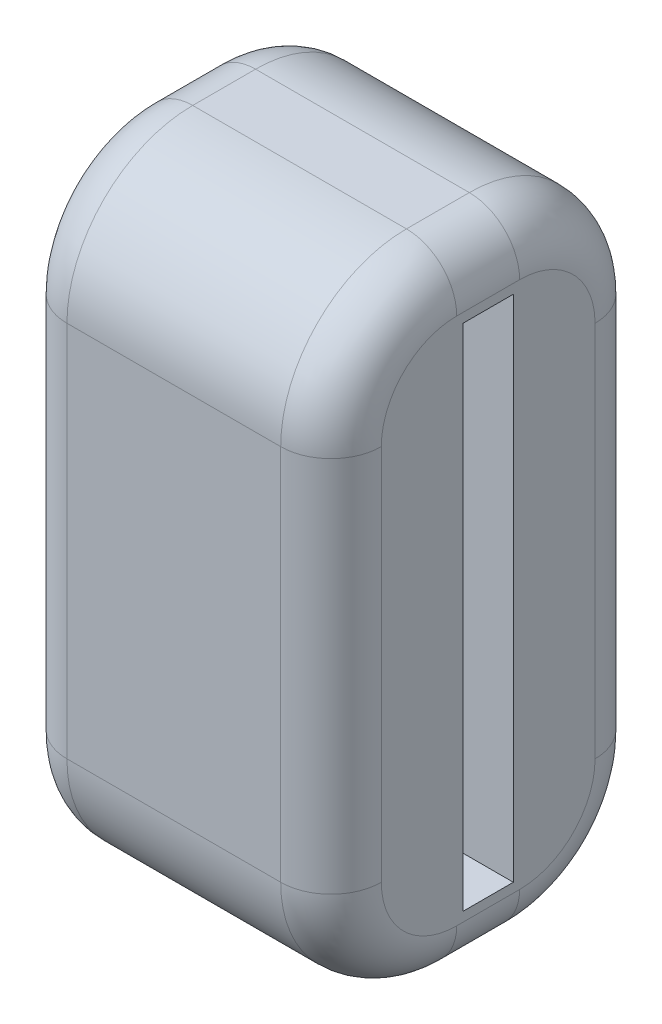
ISO-10303-21;
HEADER;
FILE_DESCRIPTION(('STEP AP214'),'2;1');
FILE_NAME('part.step','',(''),(''),'','','');
FILE_SCHEMA(('AUTOMOTIVE_DESIGN { 1 0 10303 214 1 1 1 1 }'));
ENDSEC;
DATA;
#1=APPLICATION_CONTEXT('core data for automotive mechanical design processes');
#2=APPLICATION_PROTOCOL_DEFINITION('international standard','automotive_design',2000,#1);
#3=PRODUCT_CONTEXT('',#1,'mechanical');
#4=PRODUCT('Part','Part','',(#3));
#5=PRODUCT_RELATED_PRODUCT_CATEGORY('part','',(#4));
#6=PRODUCT_DEFINITION_FORMATION('','',#4);
#7=PRODUCT_DEFINITION_CONTEXT('part definition',#1,'design');
#8=PRODUCT_DEFINITION('design','',#6,#7);
#9=PRODUCT_DEFINITION_SHAPE('','',#8);
#10=(LENGTH_UNIT() NAMED_UNIT(*) SI_UNIT(.MILLI.,.METRE.));
#11=(NAMED_UNIT(*) PLANE_ANGLE_UNIT() SI_UNIT($,.RADIAN.));
#12=(NAMED_UNIT(*) SI_UNIT($,.STERADIAN.) SOLID_ANGLE_UNIT());
#13=UNCERTAINTY_MEASURE_WITH_UNIT(LENGTH_MEASURE(1.E-05),#10,'distance_accuracy_value','');
#14=(GEOMETRIC_REPRESENTATION_CONTEXT(3) GLOBAL_UNCERTAINTY_ASSIGNED_CONTEXT((#13)) GLOBAL_UNIT_ASSIGNED_CONTEXT((#10,
#11,#12)) REPRESENTATION_CONTEXT('',''));
#15=CARTESIAN_POINT('',(0.,0.,0.));
#16=DIRECTION('',(0.,0.,1.));
#17=DIRECTION('',(1.,0.,0.));
#18=AXIS2_PLACEMENT_3D('',#15,#16,#17);
#19=CARTESIAN_POINT('',(4.2,11.7695349745345,28.9837322070634));
#20=DIRECTION('',(0.,0.,1.));
#21=DIRECTION('',(1.,0.,0.));
#22=AXIS2_PLACEMENT_3D('',#19,#20,#21);
#23=CYLINDRICAL_SURFACE('',#22,0.799999999999999);
#24=CARTESIAN_POINT('',(4.2,11.7695349745345,28.9837322070634));
#25=DIRECTION('',(0.,0.,-1.));
#26=DIRECTION('',(0.,1.,0.));
#27=AXIS2_PLACEMENT_3D('',#24,#25,#26);
#28=CIRCLE('',#27,0.799999999999998);
#29=CARTESIAN_POINT('',(5.,11.7695349745345,28.9837322070634));
#30=VERTEX_POINT('',#29);
#31=CARTESIAN_POINT('',(4.2,10.9695349745345,28.9837322070634));
#32=VERTEX_POINT('',#31);
#33=EDGE_CURVE('E74',#30,#32,#28,.T.);
#34=ORIENTED_EDGE('',*,*,#33,.F.);
#35=DIRECTION('',(0.,0.,-1.));
#36=VECTOR('',#35,1.);
#37=CARTESIAN_POINT('',(5.,11.7695349745345,29.4837322070634));
#38=LINE('',#37,#36);
#39=CARTESIAN_POINT('',(5.,11.7695349745345,29.9837322070634));
#40=VERTEX_POINT('',#39);
#41=EDGE_CURVE('E106',#40,#30,#38,.T.);
#42=ORIENTED_EDGE('',*,*,#41,.F.);
#43=CARTESIAN_POINT('',(4.2,11.7695349745345,29.9837322070634));
#44=DIRECTION('',(0.,0.,1.));
#45=DIRECTION('',(1.,0.,0.));
#46=AXIS2_PLACEMENT_3D('',#43,#44,#45);
#47=CIRCLE('',#46,0.799999999999998);
#48=CARTESIAN_POINT('',(4.2,10.9695349745345,29.9837322070634));
#49=VERTEX_POINT('',#48);
#50=EDGE_CURVE('E237',#49,#40,#47,.T.);
#51=ORIENTED_EDGE('',*,*,#50,.F.);
#52=DIRECTION('',(0.,0.,1.));
#53=VECTOR('',#52,1.);
#54=CARTESIAN_POINT('',(4.2,10.9695349745345,29.4837322070634));
#55=LINE('',#54,#53);
#56=EDGE_CURVE('E231',#32,#49,#55,.T.);
#57=ORIENTED_EDGE('',*,*,#56,.F.);
#58=EDGE_LOOP('',(#34,#42,#51,#57));
#59=FACE_BOUND('',#58,.T.);
#60=ADVANCED_FACE('F17',(#59),#23,.T.);
#61=CARTESIAN_POINT('',(4.2,12.9695349745345,28.9837322070634));
#62=DIRECTION('',(1.,0.,0.));
#63=DIRECTION('',(0.,0.,-1.));
#64=AXIS2_PLACEMENT_3D('',#61,#62,#63);
#65=TOROIDAL_SURFACE('',#64,1.2,0.799999999999998);
#66=ORIENTED_EDGE('',*,*,#33,.T.);
#67=CARTESIAN_POINT('',(4.2,12.9695349745345,28.9837322070634));
#68=DIRECTION('',(-1.,0.,0.));
#69=DIRECTION('',(0.,0.,1.));
#70=AXIS2_PLACEMENT_3D('',#67,#68,#69);
#71=CIRCLE('',#70,2.);
#72=CARTESIAN_POINT('',(4.2,12.9695349745345,26.9837322070634));
#73=VERTEX_POINT('',#72);
#74=EDGE_CURVE('E87',#73,#32,#71,.T.);
#75=ORIENTED_EDGE('',*,*,#74,.F.);
#76=CARTESIAN_POINT('',(4.2,12.9695349745345,27.7837322070634));
#77=DIRECTION('',(0.,1.,0.));
#78=DIRECTION('',(0.,0.,1.));
#79=AXIS2_PLACEMENT_3D('',#76,#77,#78);
#80=CIRCLE('',#79,0.800000000000001);
#81=CARTESIAN_POINT('',(5.,12.9695349745345,27.7837322070634));
#82=VERTEX_POINT('',#81);
#83=EDGE_CURVE('E80',#82,#73,#80,.T.);
#84=ORIENTED_EDGE('',*,*,#83,.F.);
#85=CARTESIAN_POINT('',(5.,12.9695349745345,28.9837322070634));
#86=DIRECTION('',(1.,0.,0.));
#87=DIRECTION('',(0.,0.,-1.));
#88=AXIS2_PLACEMENT_3D('',#85,#86,#87);
#89=CIRCLE('',#88,1.2);
#90=EDGE_CURVE('E21',#30,#82,#89,.T.);
#91=ORIENTED_EDGE('',*,*,#90,.F.);
#92=EDGE_LOOP('',(#66,#75,#84,#91));
#93=FACE_BOUND('',#92,.T.);
#94=ADVANCED_FACE('F82',(#93),#65,.T.);
#95=CARTESIAN_POINT('',(4.2,18.9695349745345,27.7837322070634));
#96=DIRECTION('',(0.,-1.,0.));
#97=DIRECTION('',(0.,0.,-1.));
#98=AXIS2_PLACEMENT_3D('',#95,#96,#97);
#99=CYLINDRICAL_SURFACE('',#98,0.800000000000001);
#100=ORIENTED_EDGE('',*,*,#83,.T.);
#101=DIRECTION('',(0.,-1.,0.));
#102=VECTOR('',#101,1.);
#103=CARTESIAN_POINT('',(4.2,15.9695349745345,26.9837322070634));
#104=LINE('',#103,#102);
#105=CARTESIAN_POINT('',(4.2,18.9695349745345,26.9837322070634));
#106=VERTEX_POINT('',#105);
#107=EDGE_CURVE('E152',#106,#73,#104,.T.);
#108=ORIENTED_EDGE('',*,*,#107,.F.);
#109=CARTESIAN_POINT('',(4.2,18.9695349745345,27.7837322070634));
#110=DIRECTION('',(0.,1.,0.));
#111=DIRECTION('',(0.,0.,1.));
#112=AXIS2_PLACEMENT_3D('',#109,#110,#111);
#113=CIRCLE('',#112,0.799999999999999);
#114=CARTESIAN_POINT('',(5.,18.9695349745345,27.7837322070634));
#115=VERTEX_POINT('',#114);
#116=EDGE_CURVE('E92',#115,#106,#113,.T.);
#117=ORIENTED_EDGE('',*,*,#116,.F.);
#118=DIRECTION('',(0.,1.,0.));
#119=VECTOR('',#118,1.);
#120=CARTESIAN_POINT('',(5.,15.9695349745345,27.7837322070634));
#121=LINE('',#120,#119);
#122=EDGE_CURVE('E95',#82,#115,#121,.T.);
#123=ORIENTED_EDGE('',*,*,#122,.F.);
#124=EDGE_LOOP('',(#100,#108,#117,#123));
#125=FACE_BOUND('',#124,.T.);
#126=ADVANCED_FACE('F96',(#125),#99,.T.);
#127=CARTESIAN_POINT('',(4.2,18.9695349745345,28.9837322070634));
#128=DIRECTION('',(1.,0.,0.));
#129=DIRECTION('',(0.,0.,-1.));
#130=AXIS2_PLACEMENT_3D('',#127,#128,#129);
#131=TOROIDAL_SURFACE('',#130,1.2,0.799999999999999);
#132=ORIENTED_EDGE('',*,*,#116,.T.);
#133=CARTESIAN_POINT('',(4.2,18.9695349745345,28.9837322070634));
#134=DIRECTION('',(-1.,0.,0.));
#135=DIRECTION('',(0.,0.,1.));
#136=AXIS2_PLACEMENT_3D('',#133,#134,#135);
#137=CIRCLE('',#136,2.);
#138=CARTESIAN_POINT('',(4.2,20.9695349745345,28.9837322070634));
#139=VERTEX_POINT('',#138);
#140=EDGE_CURVE('E164',#139,#106,#137,.T.);
#141=ORIENTED_EDGE('',*,*,#140,.F.);
#142=CARTESIAN_POINT('',(4.2,20.1695349745345,28.9837322070634));
#143=DIRECTION('',(0.,0.,1.));
#144=DIRECTION('',(1.,0.,0.));
#145=AXIS2_PLACEMENT_3D('',#142,#143,#144);
#146=CIRCLE('',#145,0.799999999999997);
#147=CARTESIAN_POINT('',(5.,20.1695349745345,28.9837322070634));
#148=VERTEX_POINT('',#147);
#149=EDGE_CURVE('E232',#148,#139,#146,.T.);
#150=ORIENTED_EDGE('',*,*,#149,.F.);
#151=CARTESIAN_POINT('',(5.,18.9695349745345,28.9837322070634));
#152=DIRECTION('',(1.,0.,0.));
#153=DIRECTION('',(0.,0.,-1.));
#154=AXIS2_PLACEMENT_3D('',#151,#152,#153);
#155=CIRCLE('',#154,1.20000000000001);
#156=EDGE_CURVE('E101',#115,#148,#155,.T.);
#157=ORIENTED_EDGE('',*,*,#156,.F.);
#158=EDGE_LOOP('',(#132,#141,#150,#157));
#159=FACE_BOUND('',#158,.T.);
#160=ADVANCED_FACE('F505',(#159),#131,.T.);
#161=CARTESIAN_POINT('',(4.2,20.1695349745345,29.9837322070634));
#162=DIRECTION('',(0.,0.,-1.));
#163=DIRECTION('',(-1.,0.,0.));
#164=AXIS2_PLACEMENT_3D('',#161,#162,#163);
#165=CYLINDRICAL_SURFACE('',#164,0.799999999999997);
#166=ORIENTED_EDGE('',*,*,#149,.T.);
#167=DIRECTION('',(0.,0.,-1.));
#168=VECTOR('',#167,1.);
#169=CARTESIAN_POINT('',(4.2,20.9695349745345,29.4837322070634));
#170=LINE('',#169,#168);
#171=CARTESIAN_POINT('',(4.2,20.9695349745345,29.9837322070634));
#172=VERTEX_POINT('',#171);
#173=EDGE_CURVE('E176',#172,#139,#170,.T.);
#174=ORIENTED_EDGE('',*,*,#173,.F.);
#175=CARTESIAN_POINT('',(4.2,20.1695349745345,29.9837322070634));
#176=DIRECTION('',(0.,0.,1.));
#177=DIRECTION('',(1.,0.,0.));
#178=AXIS2_PLACEMENT_3D('',#175,#176,#177);
#179=CIRCLE('',#178,0.799999999999997);
#180=CARTESIAN_POINT('',(5.,20.1695349745345,29.9837322070634));
#181=VERTEX_POINT('',#180);
#182=EDGE_CURVE('E200',#181,#172,#179,.T.);
#183=ORIENTED_EDGE('',*,*,#182,.F.);
#184=DIRECTION('',(0.,0.,1.));
#185=VECTOR('',#184,1.);
#186=CARTESIAN_POINT('',(5.,20.1695349745345,29.4837322070634));
#187=LINE('',#186,#185);
#188=EDGE_CURVE('E293',#148,#181,#187,.T.);
#189=ORIENTED_EDGE('',*,*,#188,.F.);
#190=EDGE_LOOP('',(#166,#174,#183,#189));
#191=FACE_BOUND('',#190,.T.);
#192=ADVANCED_FACE('F497',(#191),#165,.T.);
#193=CARTESIAN_POINT('',(0.79,10.9695349745345,29.9937322070634));
#194=DIRECTION('',(0.,-1.,0.));
#195=DIRECTION('',(0.,0.,-1.));
#196=AXIS2_PLACEMENT_3D('',#193,#194,#195);
#197=PLANE('',#196);
#198=ORIENTED_EDGE('',*,*,#56,.T.);
#199=DIRECTION('',(1.,0.,0.));
#200=VECTOR('',#199,1.);
#201=CARTESIAN_POINT('',(2.5,10.9695349745345,29.9837322070634));
#202=LINE('',#201,#200);
#203=CARTESIAN_POINT('',(0.8,10.9695349745345,29.9837322070634));
#204=VERTEX_POINT('',#203);
#205=EDGE_CURVE('E132',#204,#49,#202,.T.);
#206=ORIENTED_EDGE('',*,*,#205,.F.);
#207=DIRECTION('',(0.,0.,-1.));
#208=VECTOR('',#207,1.);
#209=CARTESIAN_POINT('',(0.8,10.9695349745345,29.4837322070634));
#210=LINE('',#209,#208);
#211=CARTESIAN_POINT('',(0.8,10.9695349745345,28.9837322070634));
#212=VERTEX_POINT('',#211);
#213=EDGE_CURVE('E228',#204,#212,#210,.T.);
#214=ORIENTED_EDGE('',*,*,#213,.T.);
#215=DIRECTION('',(-1.,0.,0.));
#216=VECTOR('',#215,1.);
#217=CARTESIAN_POINT('',(2.5,10.9695349745345,28.9837322070634));
#218=LINE('',#217,#216);
#219=EDGE_CURVE('E110',#32,#212,#218,.T.);
#220=ORIENTED_EDGE('',*,*,#219,.F.);
#221=EDGE_LOOP('',(#198,#206,#214,#220));
#222=FACE_BOUND('',#221,.T.);
#223=ADVANCED_FACE('F495',(#222),#197,.T.);
#224=CARTESIAN_POINT('',(4.2,12.9695349745345,29.9837322070634));
#225=DIRECTION('',(1.,0.,0.));
#226=DIRECTION('',(0.,0.,-1.));
#227=AXIS2_PLACEMENT_3D('',#224,#225,#226);
#228=TOROIDAL_SURFACE('',#227,1.2,0.799999999999996);
#229=CARTESIAN_POINT('',(4.2,12.9695349745345,31.1837322070634));
#230=DIRECTION('',(0.,-1.,0.));
#231=DIRECTION('',(0.,0.,-1.));
#232=AXIS2_PLACEMENT_3D('',#229,#230,#231);
#233=CIRCLE('',#232,0.799999999999996);
#234=CARTESIAN_POINT('',(5.,12.9695349745345,31.1837322070634));
#235=VERTEX_POINT('',#234);
#236=CARTESIAN_POINT('',(4.2,12.9695349745345,31.9837322070634));
#237=VERTEX_POINT('',#236);
#238=EDGE_CURVE('E214',#235,#237,#233,.T.);
#239=ORIENTED_EDGE('',*,*,#238,.T.);
#240=CARTESIAN_POINT('',(4.2,12.9695349745345,29.9837322070634));
#241=DIRECTION('',(-1.,0.,0.));
#242=DIRECTION('',(0.,0.,1.));
#243=AXIS2_PLACEMENT_3D('',#240,#241,#242);
#244=CIRCLE('',#243,2.);
#245=EDGE_CURVE('E135',#49,#237,#244,.T.);
#246=ORIENTED_EDGE('',*,*,#245,.F.);
#247=ORIENTED_EDGE('',*,*,#50,.T.);
#248=CARTESIAN_POINT('',(5.,12.9695349745345,29.9837322070634));
#249=DIRECTION('',(1.,0.,0.));
#250=DIRECTION('',(0.,0.,-1.));
#251=AXIS2_PLACEMENT_3D('',#248,#249,#250);
#252=CIRCLE('',#251,1.2);
#253=EDGE_CURVE('E289',#235,#40,#252,.T.);
#254=ORIENTED_EDGE('',*,*,#253,.F.);
#255=EDGE_LOOP('',(#239,#246,#247,#254));
#256=FACE_BOUND('',#255,.T.);
#257=ADVANCED_FACE('F493',(#256),#228,.T.);
#258=CARTESIAN_POINT('',(4.2,18.9695349745345,29.9837322070634));
#259=DIRECTION('',(1.,0.,0.));
#260=DIRECTION('',(0.,0.,-1.));
#261=AXIS2_PLACEMENT_3D('',#258,#259,#260);
#262=TOROIDAL_SURFACE('',#261,1.20000000000001,0.799999999999997);
#263=ORIENTED_EDGE('',*,*,#182,.T.);
#264=CARTESIAN_POINT('',(4.2,18.9695349745345,29.9837322070634));
#265=DIRECTION('',(-1.,0.,0.));
#266=DIRECTION('',(0.,0.,1.));
#267=AXIS2_PLACEMENT_3D('',#264,#265,#266);
#268=CIRCLE('',#267,2.);
#269=CARTESIAN_POINT('',(4.2,18.9695349745345,31.9837322070634));
#270=VERTEX_POINT('',#269);
#271=EDGE_CURVE('E188',#270,#172,#268,.T.);
#272=ORIENTED_EDGE('',*,*,#271,.F.);
#273=CARTESIAN_POINT('',(4.2,18.9695349745345,31.1837322070634));
#274=DIRECTION('',(0.,-1.,0.));
#275=DIRECTION('',(0.,0.,-1.));
#276=AXIS2_PLACEMENT_3D('',#273,#274,#275);
#277=CIRCLE('',#276,0.799999999999997);
#278=CARTESIAN_POINT('',(5.,18.9695349745345,31.1837322070634));
#279=VERTEX_POINT('',#278);
#280=EDGE_CURVE('E209',#279,#270,#277,.T.);
#281=ORIENTED_EDGE('',*,*,#280,.F.);
#282=CARTESIAN_POINT('',(5.,18.9695349745345,29.9837322070634));
#283=DIRECTION('',(1.,0.,0.));
#284=DIRECTION('',(0.,0.,-1.));
#285=AXIS2_PLACEMENT_3D('',#282,#283,#284);
#286=CIRCLE('',#285,1.2);
#287=EDGE_CURVE('E292',#181,#279,#286,.T.);
#288=ORIENTED_EDGE('',*,*,#287,.F.);
#289=EDGE_LOOP('',(#263,#272,#281,#288));
#290=FACE_BOUND('',#289,.T.);
#291=ADVANCED_FACE('F466',(#290),#262,.T.);
#292=CARTESIAN_POINT('',(0.79,20.9695349745345,28.9737322070634));
#293=DIRECTION('',(0.,1.,0.));
#294=DIRECTION('',(0.,0.,1.));
#295=AXIS2_PLACEMENT_3D('',#292,#293,#294);
#296=PLANE('',#295);
#297=ORIENTED_EDGE('',*,*,#173,.T.);
#298=DIRECTION('',(1.,0.,0.));
#299=VECTOR('',#298,1.);
#300=CARTESIAN_POINT('',(2.5,20.9695349745345,28.9837322070634));
#301=LINE('',#300,#299);
#302=CARTESIAN_POINT('',(0.8,20.9695349745345,28.9837322070634));
#303=VERTEX_POINT('',#302);
#304=EDGE_CURVE('E173',#303,#139,#301,.T.);
#305=ORIENTED_EDGE('',*,*,#304,.F.);
#306=DIRECTION('',(0.,0.,1.));
#307=VECTOR('',#306,1.);
#308=CARTESIAN_POINT('',(0.8,20.9695349745345,29.4837322070634));
#309=LINE('',#308,#307);
#310=CARTESIAN_POINT('',(0.8,20.9695349745345,29.9837322070634));
#311=VERTEX_POINT('',#310);
#312=EDGE_CURVE('E197',#303,#311,#309,.T.);
#313=ORIENTED_EDGE('',*,*,#312,.T.);
#314=DIRECTION('',(-1.,0.,0.));
#315=VECTOR('',#314,1.);
#316=CARTESIAN_POINT('',(2.5,20.9695349745345,29.9837322070634));
#317=LINE('',#316,#315);
#318=EDGE_CURVE('E185',#172,#311,#317,.T.);
#319=ORIENTED_EDGE('',*,*,#318,.F.);
#320=EDGE_LOOP('',(#297,#305,#313,#319));
#321=FACE_BOUND('',#320,.T.);
#322=ADVANCED_FACE('F469',(#321),#296,.T.);
#323=CARTESIAN_POINT('',(4.2,18.9695349745345,28.9837322070634));
#324=DIRECTION('',(-1.,0.,0.));
#325=DIRECTION('',(0.,0.,1.));
#326=AXIS2_PLACEMENT_3D('',#323,#324,#325);
#327=CYLINDRICAL_SURFACE('',#326,2.);
#328=ORIENTED_EDGE('',*,*,#140,.T.);
#329=DIRECTION('',(1.,0.,0.));
#330=VECTOR('',#329,1.);
#331=CARTESIAN_POINT('',(2.5,18.9695349745345,26.9837322070634));
#332=LINE('',#331,#330);
#333=CARTESIAN_POINT('',(0.800000000000002,18.9695349745345,26.9837322070634));
#334=VERTEX_POINT('',#333);
#335=EDGE_CURVE('E161',#334,#106,#332,.T.);
#336=ORIENTED_EDGE('',*,*,#335,.F.);
#337=CARTESIAN_POINT('',(0.8,18.9695349745345,28.9837322070634));
#338=DIRECTION('',(-1.,0.,0.));
#339=DIRECTION('',(0.,0.,1.));
#340=AXIS2_PLACEMENT_3D('',#337,#338,#339);
#341=CIRCLE('',#340,2.);
#342=EDGE_CURVE('E167',#303,#334,#341,.T.);
#343=ORIENTED_EDGE('',*,*,#342,.F.);
#344=ORIENTED_EDGE('',*,*,#304,.T.);
#345=EDGE_LOOP('',(#328,#336,#343,#344));
#346=FACE_BOUND('',#345,.T.);
#347=ADVANCED_FACE('F472',(#346),#327,.T.);
#348=CARTESIAN_POINT('',(0.79,12.9595349745345,26.9837322070634));
#349=DIRECTION('',(0.,0.,-1.));
#350=DIRECTION('',(0.,1.,0.));
#351=AXIS2_PLACEMENT_3D('',#348,#349,#350);
#352=PLANE('',#351);
#353=ORIENTED_EDGE('',*,*,#107,.T.);
#354=DIRECTION('',(1.,0.,0.));
#355=VECTOR('',#354,1.);
#356=CARTESIAN_POINT('',(2.5,12.9695349745345,26.9837322070634));
#357=LINE('',#356,#355);
#358=CARTESIAN_POINT('',(0.8,12.9695349745345,26.9837322070634));
#359=VERTEX_POINT('',#358);
#360=EDGE_CURVE('E150',#359,#73,#357,.T.);
#361=ORIENTED_EDGE('',*,*,#360,.F.);
#362=DIRECTION('',(0.,-1.,0.));
#363=VECTOR('',#362,1.);
#364=CARTESIAN_POINT('',(0.800000000000002,15.9695349745345,26.9837322070634));
#365=LINE('',#364,#363);
#366=EDGE_CURVE('E155',#334,#359,#365,.T.);
#367=ORIENTED_EDGE('',*,*,#366,.F.);
#368=ORIENTED_EDGE('',*,*,#335,.T.);
#369=EDGE_LOOP('',(#353,#361,#367,#368));
#370=FACE_BOUND('',#369,.T.);
#371=ADVANCED_FACE('F474',(#370),#352,.T.);
#372=CARTESIAN_POINT('',(4.2,12.9695349745345,28.9837322070634));
#373=DIRECTION('',(-1.,0.,0.));
#374=DIRECTION('',(0.,0.,1.));
#375=AXIS2_PLACEMENT_3D('',#372,#373,#374);
#376=CYLINDRICAL_SURFACE('',#375,2.);
#377=ORIENTED_EDGE('',*,*,#74,.T.);
#378=ORIENTED_EDGE('',*,*,#219,.T.);
#379=CARTESIAN_POINT('',(0.8,12.9695349745345,28.9837322070634));
#380=DIRECTION('',(-1.,0.,0.));
#381=DIRECTION('',(0.,0.,1.));
#382=AXIS2_PLACEMENT_3D('',#379,#380,#381);
#383=CIRCLE('',#382,2.);
#384=EDGE_CURVE('E139',#359,#212,#383,.T.);
#385=ORIENTED_EDGE('',*,*,#384,.F.);
#386=ORIENTED_EDGE('',*,*,#360,.T.);
#387=EDGE_LOOP('',(#377,#378,#385,#386));
#388=FACE_BOUND('',#387,.T.);
#389=ADVANCED_FACE('F477',(#388),#376,.T.);
#390=CARTESIAN_POINT('',(-0.01,11.9195349745346,29.0737322070634));
#391=DIRECTION('',(0.,1.,0.));
#392=DIRECTION('',(0.,0.,1.));
#393=AXIS2_PLACEMENT_3D('',#390,#391,#392);
#394=PLANE('',#393);
#395=DIRECTION('',(0.,0.,1.));
#396=VECTOR('',#395,1.);
#397=CARTESIAN_POINT('',(5.,11.9195349745346,29.4837322070634));
#398=LINE('',#397,#396);
#399=CARTESIAN_POINT('',(5.,11.9195349745346,29.0837322070634));
#400=VERTEX_POINT('',#399);
#401=CARTESIAN_POINT('',(5.,11.9195349745346,29.8837322070634));
#402=VERTEX_POINT('',#401);
#403=EDGE_CURVE('E291',#400,#402,#398,.T.);
#404=ORIENTED_EDGE('',*,*,#403,.F.);
#405=DIRECTION('',(1.,0.,0.));
#406=VECTOR('',#405,1.);
#407=CARTESIAN_POINT('',(2.5,11.9195349745346,29.0837322070634));
#408=LINE('',#407,#406);
#409=CARTESIAN_POINT('',(0.,11.9195349745346,29.0837322070634));
#410=VERTEX_POINT('',#409);
#411=EDGE_CURVE('E343',#410,#400,#408,.T.);
#412=ORIENTED_EDGE('',*,*,#411,.F.);
#413=DIRECTION('',(0.,0.,1.));
#414=VECTOR('',#413,1.);
#415=CARTESIAN_POINT('',(0.,11.9195349745346,29.4837322070634));
#416=LINE('',#415,#414);
#417=CARTESIAN_POINT('',(0.,11.9195349745346,29.8837322070634));
#418=VERTEX_POINT('',#417);
#419=EDGE_CURVE('E107',#410,#418,#416,.T.);
#420=ORIENTED_EDGE('',*,*,#419,.T.);
#421=DIRECTION('',(-1.,0.,0.));
#422=VECTOR('',#421,1.);
#423=CARTESIAN_POINT('',(2.5,11.9195349745346,29.8837322070634));
#424=LINE('',#423,#422);
#425=EDGE_CURVE('E340',#402,#418,#424,.T.);
#426=ORIENTED_EDGE('',*,*,#425,.F.);
#427=EDGE_LOOP('',(#404,#412,#420,#426));
#428=FACE_BOUND('',#427,.T.);
#429=ADVANCED_FACE('F548',(#428),#394,.T.);
#430=CARTESIAN_POINT('',(5.,11.7595349745345,31.1937322070634));
#431=DIRECTION('',(1.,0.,0.));
#432=DIRECTION('',(0.,0.,-1.));
#433=AXIS2_PLACEMENT_3D('',#430,#431,#432);
#434=PLANE('',#433);
#435=ORIENTED_EDGE('',*,*,#403,.T.);
#436=DIRECTION('',(0.,-1.,0.));
#437=VECTOR('',#436,1.);
#438=CARTESIAN_POINT('',(5.,15.9695349745346,29.8837322070634));
#439=LINE('',#438,#437);
#440=CARTESIAN_POINT('',(5.,20.0195349745346,29.8837322070634));
#441=VERTEX_POINT('',#440);
#442=EDGE_CURVE('E337',#441,#402,#439,.T.);
#443=ORIENTED_EDGE('',*,*,#442,.F.);
#444=DIRECTION('',(0.,0.,1.));
#445=VECTOR('',#444,1.);
#446=CARTESIAN_POINT('',(5.,20.0195349745346,29.4837322070634));
#447=LINE('',#446,#445);
#448=CARTESIAN_POINT('',(5.,20.0195349745346,29.0837322070634));
#449=VERTEX_POINT('',#448);
#450=EDGE_CURVE('E136',#449,#441,#447,.T.);
#451=ORIENTED_EDGE('',*,*,#450,.F.);
#452=DIRECTION('',(0.,1.,0.));
#453=VECTOR('',#452,1.);
#454=CARTESIAN_POINT('',(5.,15.9695349745346,29.0837322070634));
#455=LINE('',#454,#453);
#456=EDGE_CURVE('E346',#400,#449,#455,.T.);
#457=ORIENTED_EDGE('',*,*,#456,.F.);
#458=EDGE_LOOP('',(#435,#443,#451,#457));
#459=FACE_BOUND('',#458,.T.);
#460=DIRECTION('',(0.,1.,0.));
#461=VECTOR('',#460,1.);
#462=CARTESIAN_POINT('',(5.,15.9695349745345,31.1837322070634));
#463=LINE('',#462,#461);
#464=EDGE_CURVE('E219',#235,#279,#463,.T.);
#465=ORIENTED_EDGE('',*,*,#464,.F.);
#466=ORIENTED_EDGE('',*,*,#253,.T.);
#467=ORIENTED_EDGE('',*,*,#41,.T.);
#468=ORIENTED_EDGE('',*,*,#90,.T.);
#469=ORIENTED_EDGE('',*,*,#122,.T.);
#470=ORIENTED_EDGE('',*,*,#156,.T.);
#471=ORIENTED_EDGE('',*,*,#188,.T.);
#472=ORIENTED_EDGE('',*,*,#287,.T.);
#473=EDGE_LOOP('',(#465,#466,#467,#468,#469,#470,#471,#472));
#474=FACE_BOUND('',#473,.T.);
#475=ADVANCED_FACE('F104',(#459,#474),#434,.T.);
#476=CARTESIAN_POINT('',(-0.01,20.0195349745346,29.8937322070634));
#477=DIRECTION('',(0.,-1.,0.));
#478=DIRECTION('',(0.,0.,-1.));
#479=AXIS2_PLACEMENT_3D('',#476,#477,#478);
#480=PLANE('',#479);
#481=ORIENTED_EDGE('',*,*,#450,.T.);
#482=DIRECTION('',(1.,0.,0.));
#483=VECTOR('',#482,1.);
#484=CARTESIAN_POINT('',(2.5,20.0195349745346,29.8837322070634));
#485=LINE('',#484,#483);
#486=CARTESIAN_POINT('',(0.,20.0195349745346,29.8837322070634));
#487=VERTEX_POINT('',#486);
#488=EDGE_CURVE('E334',#487,#441,#485,.T.);
#489=ORIENTED_EDGE('',*,*,#488,.F.);
#490=DIRECTION('',(0.,0.,-1.));
#491=VECTOR('',#490,1.);
#492=CARTESIAN_POINT('',(0.,20.0195349745346,29.4837322070634));
#493=LINE('',#492,#491);
#494=CARTESIAN_POINT('',(0.,20.0195349745346,29.0837322070634));
#495=VERTEX_POINT('',#494);
#496=EDGE_CURVE('E299',#487,#495,#493,.T.);
#497=ORIENTED_EDGE('',*,*,#496,.T.);
#498=DIRECTION('',(-1.,0.,0.));
#499=VECTOR('',#498,1.);
#500=CARTESIAN_POINT('',(2.5,20.0195349745346,29.0837322070634));
#501=LINE('',#500,#499);
#502=EDGE_CURVE('E122',#449,#495,#501,.T.);
#503=ORIENTED_EDGE('',*,*,#502,.F.);
#504=EDGE_LOOP('',(#481,#489,#497,#503));
#505=FACE_BOUND('',#504,.T.);
#506=ADVANCED_FACE('F542',(#505),#480,.T.);
#507=CARTESIAN_POINT('',(4.2,12.9695349745345,29.9837322070634));
#508=DIRECTION('',(-1.,0.,0.));
#509=DIRECTION('',(0.,0.,1.));
#510=AXIS2_PLACEMENT_3D('',#507,#508,#509);
#511=CYLINDRICAL_SURFACE('',#510,2.);
#512=ORIENTED_EDGE('',*,*,#245,.T.);
#513=DIRECTION('',(1.,0.,0.));
#514=VECTOR('',#513,1.);
#515=CARTESIAN_POINT('',(2.5,12.9695349745345,31.9837322070634));
#516=LINE('',#515,#514);
#517=CARTESIAN_POINT('',(0.800000000000001,12.9695349745345,31.9837322070634));
#518=VERTEX_POINT('',#517);
#519=EDGE_CURVE('E118',#518,#237,#516,.T.);
#520=ORIENTED_EDGE('',*,*,#519,.F.);
#521=CARTESIAN_POINT('',(0.8,12.9695349745345,29.9837322070634));
#522=DIRECTION('',(-1.,0.,0.));
#523=DIRECTION('',(0.,0.,1.));
#524=AXIS2_PLACEMENT_3D('',#521,#522,#523);
#525=CIRCLE('',#524,2.);
#526=EDGE_CURVE('E125',#204,#518,#525,.T.);
#527=ORIENTED_EDGE('',*,*,#526,.F.);
#528=ORIENTED_EDGE('',*,*,#205,.T.);
#529=EDGE_LOOP('',(#512,#520,#527,#528));
#530=FACE_BOUND('',#529,.T.);
#531=ADVANCED_FACE('F490',(#530),#511,.T.);
#532=CARTESIAN_POINT('',(4.2,12.9695349745345,31.1837322070634));
#533=DIRECTION('',(0.,1.,0.));
#534=DIRECTION('',(0.,0.,1.));
#535=AXIS2_PLACEMENT_3D('',#532,#533,#534);
#536=CYLINDRICAL_SURFACE('',#535,0.799999999999997);
#537=ORIENTED_EDGE('',*,*,#280,.T.);
#538=DIRECTION('',(0.,1.,0.));
#539=VECTOR('',#538,1.);
#540=CARTESIAN_POINT('',(4.2,15.9695349745345,31.9837322070634));
#541=LINE('',#540,#539);
#542=EDGE_CURVE('E121',#237,#270,#541,.T.);
#543=ORIENTED_EDGE('',*,*,#542,.F.);
#544=ORIENTED_EDGE('',*,*,#238,.F.);
#545=ORIENTED_EDGE('',*,*,#464,.T.);
#546=EDGE_LOOP('',(#537,#543,#544,#545));
#547=FACE_BOUND('',#546,.T.);
#548=ADVANCED_FACE('F461',(#547),#536,.T.);
#549=CARTESIAN_POINT('',(4.2,18.9695349745345,29.9837322070634));
#550=DIRECTION('',(-1.,0.,0.));
#551=DIRECTION('',(0.,0.,1.));
#552=AXIS2_PLACEMENT_3D('',#549,#550,#551);
#553=CYLINDRICAL_SURFACE('',#552,2.);
#554=ORIENTED_EDGE('',*,*,#271,.T.);
#555=ORIENTED_EDGE('',*,*,#318,.T.);
#556=CARTESIAN_POINT('',(0.8,18.9695349745345,29.9837322070634));
#557=DIRECTION('',(-1.,0.,0.));
#558=DIRECTION('',(0.,0.,1.));
#559=AXIS2_PLACEMENT_3D('',#556,#557,#558);
#560=CIRCLE('',#559,2.);
#561=CARTESIAN_POINT('',(0.800000000000001,18.9695349745345,31.9837322070634));
#562=VERTEX_POINT('',#561);
#563=EDGE_CURVE('E179',#562,#311,#560,.T.);
#564=ORIENTED_EDGE('',*,*,#563,.F.);
#565=DIRECTION('',(-1.,0.,0.));
#566=VECTOR('',#565,1.);
#567=CARTESIAN_POINT('',(2.5,18.9695349745345,31.9837322070634));
#568=LINE('',#567,#566);
#569=EDGE_CURVE('E191',#270,#562,#568,.T.);
#570=ORIENTED_EDGE('',*,*,#569,.F.);
#571=EDGE_LOOP('',(#554,#555,#564,#570));
#572=FACE_BOUND('',#571,.T.);
#573=ADVANCED_FACE('F453',(#572),#553,.T.);
#574=CARTESIAN_POINT('',(0.8,18.9695349745345,29.9837322070634));
#575=DIRECTION('',(1.,0.,0.));
#576=DIRECTION('',(0.,0.,-1.));
#577=AXIS2_PLACEMENT_3D('',#574,#575,#576);
#578=TOROIDAL_SURFACE('',#577,1.20000000000001,0.799999999999996);
#579=CARTESIAN_POINT('',(0.8,18.9695349745345,31.1837322070634));
#580=DIRECTION('',(0.,1.,0.));
#581=DIRECTION('',(0.,0.,1.));
#582=AXIS2_PLACEMENT_3D('',#579,#580,#581);
#583=CIRCLE('',#582,0.799999999999995);
#584=CARTESIAN_POINT('',(0.,18.9695349745345,31.1837322070634));
#585=VERTEX_POINT('',#584);
#586=EDGE_CURVE('E35',#585,#562,#583,.T.);
#587=ORIENTED_EDGE('',*,*,#586,.T.);
#588=ORIENTED_EDGE('',*,*,#563,.T.);
#589=CARTESIAN_POINT('',(0.800000000000002,20.1695349745345,29.9837322070634));
#590=DIRECTION('',(0.,0.,-1.));
#591=DIRECTION('',(0.,1.,0.));
#592=AXIS2_PLACEMENT_3D('',#589,#590,#591);
#593=CIRCLE('',#592,0.799999999999999);
#594=CARTESIAN_POINT('',(0.,20.1695349745345,29.9837322070634));
#595=VERTEX_POINT('',#594);
#596=EDGE_CURVE('E182',#595,#311,#593,.T.);
#597=ORIENTED_EDGE('',*,*,#596,.F.);
#598=CARTESIAN_POINT('',(0.,18.9695349745345,29.9837322070634));
#599=DIRECTION('',(1.,0.,0.));
#600=DIRECTION('',(0.,0.,-1.));
#601=AXIS2_PLACEMENT_3D('',#598,#599,#600);
#602=CIRCLE('',#601,1.20000000000001);
#603=EDGE_CURVE('E194',#585,#595,#602,.F.);
#604=ORIENTED_EDGE('',*,*,#603,.F.);
#605=EDGE_LOOP('',(#587,#588,#597,#604));
#606=FACE_BOUND('',#605,.T.);
#607=ADVANCED_FACE('F450',(#606),#578,.T.);
#608=CARTESIAN_POINT('',(0.800000000000002,20.1695349745345,28.9837322070634));
#609=DIRECTION('',(0.,0.,1.));
#610=DIRECTION('',(0.,-1.,0.));
#611=AXIS2_PLACEMENT_3D('',#608,#609,#610);
#612=CYLINDRICAL_SURFACE('',#611,0.799999999999999);
#613=ORIENTED_EDGE('',*,*,#596,.T.);
#614=ORIENTED_EDGE('',*,*,#312,.F.);
#615=CARTESIAN_POINT('',(0.8,20.1695349745345,28.9837322070634));
#616=DIRECTION('',(0.,0.,-1.));
#617=DIRECTION('',(0.,1.,0.));
#618=AXIS2_PLACEMENT_3D('',#615,#616,#617);
#619=CIRCLE('',#618,0.799999999999995);
#620=CARTESIAN_POINT('',(0.,20.1695349745345,28.9837322070634));
#621=VERTEX_POINT('',#620);
#622=EDGE_CURVE('E170',#621,#303,#619,.T.);
#623=ORIENTED_EDGE('',*,*,#622,.F.);
#624=DIRECTION('',(0.,0.,-1.));
#625=VECTOR('',#624,1.);
#626=CARTESIAN_POINT('',(0.,20.1695349745345,29.4837322070634));
#627=LINE('',#626,#625);
#628=EDGE_CURVE('E286',#595,#621,#627,.T.);
#629=ORIENTED_EDGE('',*,*,#628,.F.);
#630=EDGE_LOOP('',(#613,#614,#623,#629));
#631=FACE_BOUND('',#630,.T.);
#632=ADVANCED_FACE('F447',(#631),#612,.T.);
#633=CARTESIAN_POINT('',(0.8,18.9695349745345,28.9837322070634));
#634=DIRECTION('',(1.,0.,0.));
#635=DIRECTION('',(0.,0.,-1.));
#636=AXIS2_PLACEMENT_3D('',#633,#634,#635);
#637=TOROIDAL_SURFACE('',#636,1.2,0.799999999999999);
#638=ORIENTED_EDGE('',*,*,#622,.T.);
#639=ORIENTED_EDGE('',*,*,#342,.T.);
#640=CARTESIAN_POINT('',(0.800000000000002,18.9695349745345,27.7837322070634));
#641=DIRECTION('',(0.,-1.,0.));
#642=DIRECTION('',(0.,0.,-1.));
#643=AXIS2_PLACEMENT_3D('',#640,#641,#642);
#644=CIRCLE('',#643,0.800000000000003);
#645=CARTESIAN_POINT('',(0.,18.9695349745345,27.7837322070634));
#646=VERTEX_POINT('',#645);
#647=EDGE_CURVE('E158',#646,#334,#644,.T.);
#648=ORIENTED_EDGE('',*,*,#647,.F.);
#649=CARTESIAN_POINT('',(0.,18.9695349745345,28.9837322070634));
#650=DIRECTION('',(1.,0.,0.));
#651=DIRECTION('',(0.,0.,-1.));
#652=AXIS2_PLACEMENT_3D('',#649,#650,#651);
#653=CIRCLE('',#652,1.2);
#654=EDGE_CURVE('E283',#621,#646,#653,.F.);
#655=ORIENTED_EDGE('',*,*,#654,.F.);
#656=EDGE_LOOP('',(#638,#639,#648,#655));
#657=FACE_BOUND('',#656,.T.);
#658=ADVANCED_FACE('F440',(#657),#637,.T.);
#659=CARTESIAN_POINT('',(0.800000000000002,12.9695349745345,27.7837322070634));
#660=DIRECTION('',(0.,1.,0.));
#661=DIRECTION('',(0.,0.,1.));
#662=AXIS2_PLACEMENT_3D('',#659,#660,#661);
#663=CYLINDRICAL_SURFACE('',#662,0.800000000000003);
#664=ORIENTED_EDGE('',*,*,#647,.T.);
#665=ORIENTED_EDGE('',*,*,#366,.T.);
#666=CARTESIAN_POINT('',(0.8,12.9695349745345,27.7837322070634));
#667=DIRECTION('',(0.,-1.,0.));
#668=DIRECTION('',(0.,0.,-1.));
#669=AXIS2_PLACEMENT_3D('',#666,#667,#668);
#670=CIRCLE('',#669,0.8);
#671=CARTESIAN_POINT('',(0.,12.9695349745345,27.7837322070634));
#672=VERTEX_POINT('',#671);
#673=EDGE_CURVE('E143',#672,#359,#670,.T.);
#674=ORIENTED_EDGE('',*,*,#673,.F.);
#675=DIRECTION('',(0.,-1.,0.));
#676=VECTOR('',#675,1.);
#677=CARTESIAN_POINT('',(0.,15.9695349745345,27.7837322070634));
#678=LINE('',#677,#676);
#679=EDGE_CURVE('E282',#646,#672,#678,.T.);
#680=ORIENTED_EDGE('',*,*,#679,.F.);
#681=EDGE_LOOP('',(#664,#665,#674,#680));
#682=FACE_BOUND('',#681,.T.);
#683=ADVANCED_FACE('F444',(#682),#663,.T.);
#684=CARTESIAN_POINT('',(0.8,12.9695349745345,28.9837322070634));
#685=DIRECTION('',(1.,0.,0.));
#686=DIRECTION('',(0.,0.,-1.));
#687=AXIS2_PLACEMENT_3D('',#684,#685,#686);
#688=TOROIDAL_SURFACE('',#687,1.2,0.799999999999998);
#689=ORIENTED_EDGE('',*,*,#673,.T.);
#690=ORIENTED_EDGE('',*,*,#384,.T.);
#691=CARTESIAN_POINT('',(0.8,11.7695349745345,28.9837322070634));
#692=DIRECTION('',(0.,0.,1.));
#693=DIRECTION('',(0.,-1.,0.));
#694=AXIS2_PLACEMENT_3D('',#691,#692,#693);
#695=CIRCLE('',#694,0.799999999999999);
#696=CARTESIAN_POINT('',(0.,11.7695349745345,28.9837322070634));
#697=VERTEX_POINT('',#696);
#698=EDGE_CURVE('E142',#697,#212,#695,.T.);
#699=ORIENTED_EDGE('',*,*,#698,.F.);
#700=CARTESIAN_POINT('',(0.,12.9695349745345,28.9837322070634));
#701=DIRECTION('',(1.,0.,0.));
#702=DIRECTION('',(0.,0.,-1.));
#703=AXIS2_PLACEMENT_3D('',#700,#701,#702);
#704=CIRCLE('',#703,1.2);
#705=EDGE_CURVE('E279',#672,#697,#704,.F.);
#706=ORIENTED_EDGE('',*,*,#705,.F.);
#707=EDGE_LOOP('',(#689,#690,#699,#706));
#708=FACE_BOUND('',#707,.T.);
#709=ADVANCED_FACE('F480',(#708),#688,.T.);
#710=CARTESIAN_POINT('',(0.8,11.7695349745345,29.9837322070634));
#711=DIRECTION('',(0.,0.,-1.));
#712=DIRECTION('',(0.,1.,0.));
#713=AXIS2_PLACEMENT_3D('',#710,#711,#712);
#714=CYLINDRICAL_SURFACE('',#713,0.799999999999999);
#715=ORIENTED_EDGE('',*,*,#698,.T.);
#716=ORIENTED_EDGE('',*,*,#213,.F.);
#717=CARTESIAN_POINT('',(0.8,11.7695349745345,29.9837322070634));
#718=DIRECTION('',(0.,0.,1.));
#719=DIRECTION('',(1.,0.,0.));
#720=AXIS2_PLACEMENT_3D('',#717,#718,#719);
#721=CIRCLE('',#720,0.799999999999998);
#722=CARTESIAN_POINT('',(0.,11.7695349745345,29.9837322070634));
#723=VERTEX_POINT('',#722);
#724=EDGE_CURVE('E129',#723,#204,#721,.T.);
#725=ORIENTED_EDGE('',*,*,#724,.F.);
#726=DIRECTION('',(0.,0.,1.));
#727=VECTOR('',#726,1.);
#728=CARTESIAN_POINT('',(0.,11.7695349745345,29.4837322070634));
#729=LINE('',#728,#727);
#730=EDGE_CURVE('E278',#697,#723,#729,.T.);
#731=ORIENTED_EDGE('',*,*,#730,.F.);
#732=EDGE_LOOP('',(#715,#716,#725,#731));
#733=FACE_BOUND('',#732,.T.);
#734=ADVANCED_FACE('F484',(#733),#714,.T.);
#735=CARTESIAN_POINT('',(0.8,12.9695349745345,29.9837322070634));
#736=DIRECTION('',(1.,0.,0.));
#737=DIRECTION('',(0.,0.,-1.));
#738=AXIS2_PLACEMENT_3D('',#735,#736,#737);
#739=TOROIDAL_SURFACE('',#738,1.2,0.799999999999997);
#740=CARTESIAN_POINT('',(0.8,12.9695349745345,31.1837322070634));
#741=DIRECTION('',(0.,-1.,0.));
#742=DIRECTION('',(0.,0.,-1.));
#743=AXIS2_PLACEMENT_3D('',#740,#741,#742);
#744=CIRCLE('',#743,0.799999999999997);
#745=CARTESIAN_POINT('',(0.,12.9695349745345,31.1837322070634));
#746=VERTEX_POINT('',#745);
#747=EDGE_CURVE('E128',#518,#746,#744,.T.);
#748=ORIENTED_EDGE('',*,*,#747,.T.);
#749=CARTESIAN_POINT('',(0.,12.9695349745345,29.9837322070634));
#750=DIRECTION('',(1.,0.,0.));
#751=DIRECTION('',(0.,0.,-1.));
#752=AXIS2_PLACEMENT_3D('',#749,#750,#751);
#753=CIRCLE('',#752,1.2);
#754=EDGE_CURVE('E274',#723,#746,#753,.F.);
#755=ORIENTED_EDGE('',*,*,#754,.F.);
#756=ORIENTED_EDGE('',*,*,#724,.T.);
#757=ORIENTED_EDGE('',*,*,#526,.T.);
#758=EDGE_LOOP('',(#748,#755,#756,#757));
#759=FACE_BOUND('',#758,.T.);
#760=ADVANCED_FACE('F487',(#759),#739,.T.);
#761=CARTESIAN_POINT('',(-0.01,11.9095349745346,29.8837322070634));
#762=DIRECTION('',(0.,0.,-1.));
#763=DIRECTION('',(0.,1.,0.));
#764=AXIS2_PLACEMENT_3D('',#761,#762,#763);
#765=PLANE('',#764);
#766=ORIENTED_EDGE('',*,*,#442,.T.);
#767=ORIENTED_EDGE('',*,*,#425,.T.);
#768=DIRECTION('',(0.,-1.,0.));
#769=VECTOR('',#768,1.);
#770=CARTESIAN_POINT('',(0.,15.9695349745345,29.8837322070634));
#771=LINE('',#770,#769);
#772=EDGE_CURVE('E277',#487,#418,#771,.T.);
#773=ORIENTED_EDGE('',*,*,#772,.F.);
#774=ORIENTED_EDGE('',*,*,#488,.T.);
#775=EDGE_LOOP('',(#766,#767,#773,#774));
#776=FACE_BOUND('',#775,.T.);
#777=ADVANCED_FACE('F518',(#776),#765,.T.);
#778=CARTESIAN_POINT('',(-0.01,20.0295349745346,29.0837322070634));
#779=DIRECTION('',(0.,0.,1.));
#780=DIRECTION('',(0.,-1.,0.));
#781=AXIS2_PLACEMENT_3D('',#778,#779,#780);
#782=PLANE('',#781);
#783=ORIENTED_EDGE('',*,*,#456,.T.);
#784=ORIENTED_EDGE('',*,*,#502,.T.);
#785=DIRECTION('',(0.,1.,0.));
#786=VECTOR('',#785,1.);
#787=CARTESIAN_POINT('',(0.,15.9695349745345,29.0837322070634));
#788=LINE('',#787,#786);
#789=EDGE_CURVE('E115',#410,#495,#788,.T.);
#790=ORIENTED_EDGE('',*,*,#789,.F.);
#791=ORIENTED_EDGE('',*,*,#411,.T.);
#792=EDGE_LOOP('',(#783,#784,#790,#791));
#793=FACE_BOUND('',#792,.T.);
#794=ADVANCED_FACE('F373',(#793),#782,.T.);
#795=CARTESIAN_POINT('',(0.79,18.9795349745345,31.9837322070634));
#796=DIRECTION('',(0.,0.,1.));
#797=DIRECTION('',(0.,-1.,0.));
#798=AXIS2_PLACEMENT_3D('',#795,#796,#797);
#799=PLANE('',#798);
#800=ORIENTED_EDGE('',*,*,#542,.T.);
#801=ORIENTED_EDGE('',*,*,#569,.T.);
#802=DIRECTION('',(0.,1.,0.));
#803=VECTOR('',#802,1.);
#804=CARTESIAN_POINT('',(0.800000000000002,15.9695349745345,31.9837322070634));
#805=LINE('',#804,#803);
#806=EDGE_CURVE('E27',#518,#562,#805,.T.);
#807=ORIENTED_EDGE('',*,*,#806,.F.);
#808=ORIENTED_EDGE('',*,*,#519,.T.);
#809=EDGE_LOOP('',(#800,#801,#807,#808));
#810=FACE_BOUND('',#809,.T.);
#811=ADVANCED_FACE('F458',(#810),#799,.T.);
#812=CARTESIAN_POINT('',(0.,11.7595349745345,27.7737322070634));
#813=DIRECTION('',(-1.,0.,0.));
#814=DIRECTION('',(0.,0.,1.));
#815=AXIS2_PLACEMENT_3D('',#812,#813,#814);
#816=PLANE('',#815);
#817=ORIENTED_EDGE('',*,*,#419,.F.);
#818=ORIENTED_EDGE('',*,*,#789,.T.);
#819=ORIENTED_EDGE('',*,*,#496,.F.);
#820=ORIENTED_EDGE('',*,*,#772,.T.);
#821=EDGE_LOOP('',(#817,#818,#819,#820));
#822=FACE_BOUND('',#821,.T.);
#823=ORIENTED_EDGE('',*,*,#730,.T.);
#824=ORIENTED_EDGE('',*,*,#754,.T.);
#825=DIRECTION('',(0.,-1.,0.));
#826=VECTOR('',#825,1.);
#827=CARTESIAN_POINT('',(0.,15.9695349745345,31.1837322070634));
#828=LINE('',#827,#826);
#829=EDGE_CURVE('E11',#585,#746,#828,.T.);
#830=ORIENTED_EDGE('',*,*,#829,.F.);
#831=ORIENTED_EDGE('',*,*,#603,.T.);
#832=ORIENTED_EDGE('',*,*,#628,.T.);
#833=ORIENTED_EDGE('',*,*,#654,.T.);
#834=ORIENTED_EDGE('',*,*,#679,.T.);
#835=ORIENTED_EDGE('',*,*,#705,.T.);
#836=EDGE_LOOP('',(#823,#824,#830,#831,#832,#833,#834,#835));
#837=FACE_BOUND('',#836,.T.);
#838=ADVANCED_FACE('F365',(#822,#837),#816,.T.);
#839=CARTESIAN_POINT('',(0.800000000000002,18.9695349745345,31.1837322070634));
#840=DIRECTION('',(0.,-1.,0.));
#841=DIRECTION('',(0.,0.,-1.));
#842=AXIS2_PLACEMENT_3D('',#839,#840,#841);
#843=CYLINDRICAL_SURFACE('',#842,0.799999999999999);
#844=ORIENTED_EDGE('',*,*,#586,.F.);
#845=ORIENTED_EDGE('',*,*,#829,.T.);
#846=ORIENTED_EDGE('',*,*,#747,.F.);
#847=ORIENTED_EDGE('',*,*,#806,.T.);
#848=EDGE_LOOP('',(#844,#845,#846,#847));
#849=FACE_BOUND('',#848,.T.);
#850=ADVANCED_FACE('F19',(#849),#843,.T.);
#851=CLOSED_SHELL('',(#60,#94,#126,#160,#192,#223,#257,#291,#322,#347,#371,#389,#429,#475,#506,
#531,#548,#573,#607,#632,#658,#683,#709,#734,#760,#777,#794,#811,#838,#850));
#852=MANIFOLD_SOLID_BREP('B1',#851);
#853=ADVANCED_BREP_SHAPE_REPRESENTATION('',(#18,#852),#14);
#854=SHAPE_DEFINITION_REPRESENTATION(#9,#853);
ENDSEC;
END-ISO-10303-21;
